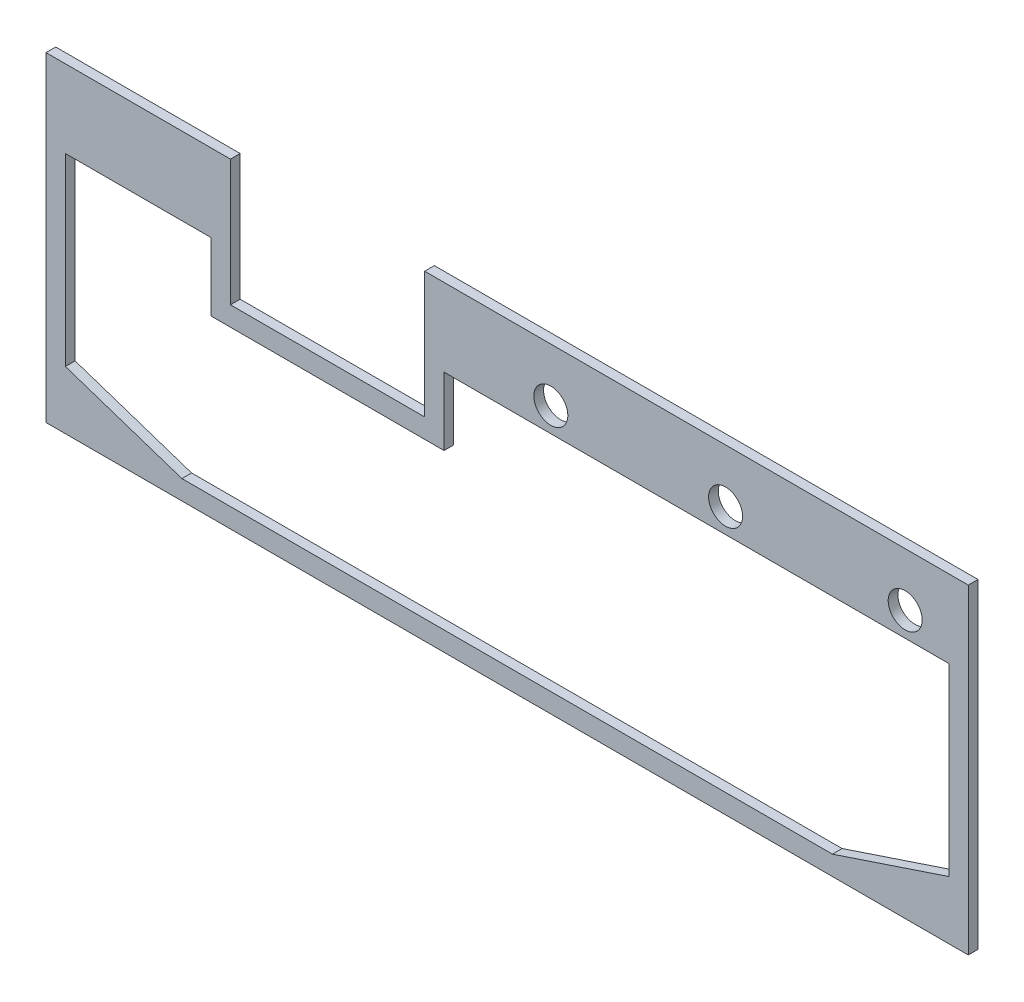
ISO-10303-21;
HEADER;
FILE_DESCRIPTION(('STEP AP214'),'2;1');
FILE_NAME('part.step','',(''),(''),'','','');
FILE_SCHEMA(('AUTOMOTIVE_DESIGN { 1 0 10303 214 1 1 1 1 }'));
ENDSEC;
DATA;
#1=APPLICATION_CONTEXT('core data for automotive mechanical design processes');
#2=APPLICATION_PROTOCOL_DEFINITION('international standard','automotive_design',2000,#1);
#3=PRODUCT_CONTEXT('',#1,'mechanical');
#4=PRODUCT('Part','Part','',(#3));
#5=PRODUCT_RELATED_PRODUCT_CATEGORY('part','',(#4));
#6=PRODUCT_DEFINITION_FORMATION('','',#4);
#7=PRODUCT_DEFINITION_CONTEXT('part definition',#1,'design');
#8=PRODUCT_DEFINITION('design','',#6,#7);
#9=PRODUCT_DEFINITION_SHAPE('','',#8);
#10=(LENGTH_UNIT() NAMED_UNIT(*) SI_UNIT(.MILLI.,.METRE.));
#11=(NAMED_UNIT(*) PLANE_ANGLE_UNIT() SI_UNIT($,.RADIAN.));
#12=(NAMED_UNIT(*) SI_UNIT($,.STERADIAN.) SOLID_ANGLE_UNIT());
#13=UNCERTAINTY_MEASURE_WITH_UNIT(LENGTH_MEASURE(1.E-05),#10,'distance_accuracy_value','');
#14=(GEOMETRIC_REPRESENTATION_CONTEXT(3) GLOBAL_UNCERTAINTY_ASSIGNED_CONTEXT((#13)) GLOBAL_UNIT_ASSIGNED_CONTEXT((#10,
#11,#12)) REPRESENTATION_CONTEXT('',''));
#15=CARTESIAN_POINT('',(0.,0.,0.));
#16=DIRECTION('',(0.,0.,1.));
#17=DIRECTION('',(1.,0.,0.));
#18=AXIS2_PLACEMENT_3D('',#15,#16,#17);
#19=CARTESIAN_POINT('',(0.,0.,1.));
#20=DIRECTION('',(0.,0.,-1.));
#21=DIRECTION('',(-1.,0.,0.));
#22=AXIS2_PLACEMENT_3D('',#19,#20,#21);
#23=PLANE('',#22);
#24=CARTESIAN_POINT('',(-41.,2.5,1.));
#25=DIRECTION('',(0.,0.,1.));
#26=DIRECTION('',(1.,0.,0.));
#27=AXIS2_PLACEMENT_3D('',#24,#25,#26);
#28=CIRCLE('',#27,1.75);
#29=CARTESIAN_POINT('',(-39.25,2.5,1.));
#30=VERTEX_POINT('',#29);
#31=EDGE_CURVE('E469',#30,#30,#28,.T.);
#32=ORIENTED_EDGE('',*,*,#31,.F.);
#33=EDGE_LOOP('',(#32));
#34=FACE_BOUND('',#33,.T.);
#35=CARTESIAN_POINT('',(-23.,2.5,1.));
#36=DIRECTION('',(0.,0.,1.));
#37=DIRECTION('',(1.,0.,0.));
#38=AXIS2_PLACEMENT_3D('',#35,#36,#37);
#39=CIRCLE('',#38,1.75);
#40=CARTESIAN_POINT('',(-21.25,2.5,1.));
#41=VERTEX_POINT('',#40);
#42=EDGE_CURVE('E474',#41,#41,#39,.T.);
#43=ORIENTED_EDGE('',*,*,#42,.F.);
#44=EDGE_LOOP('',(#43));
#45=FACE_BOUND('',#44,.T.);
#46=DIRECTION('',(-1.,0.,0.));
#47=VECTOR('',#46,1.);
#48=CARTESIAN_POINT('',(-54.,7.99999999999999,1.));
#49=LINE('',#48,#47);
#50=CARTESIAN_POINT('',(2.,7.99999999999999,1.));
#51=VERTEX_POINT('',#50);
#52=CARTESIAN_POINT('',(-54.,7.99999999999999,1.));
#53=VERTEX_POINT('',#52);
#54=EDGE_CURVE('E277',#51,#53,#49,.T.);
#55=ORIENTED_EDGE('',*,*,#54,.T.);
#56=DIRECTION('',(0.,-1.,0.));
#57=VECTOR('',#56,1.);
#58=CARTESIAN_POINT('',(-54.,-5.,1.));
#59=LINE('',#58,#57);
#60=CARTESIAN_POINT('',(-54.,-5.,1.));
#61=VERTEX_POINT('',#60);
#62=EDGE_CURVE('E281',#53,#61,#59,.T.);
#63=ORIENTED_EDGE('',*,*,#62,.T.);
#64=DIRECTION('',(-1.,0.,0.));
#65=VECTOR('',#64,1.);
#66=CARTESIAN_POINT('',(-74.,-5.,1.));
#67=LINE('',#66,#65);
#68=CARTESIAN_POINT('',(-74.,-5.,1.));
#69=VERTEX_POINT('',#68);
#70=EDGE_CURVE('E285',#61,#69,#67,.T.);
#71=ORIENTED_EDGE('',*,*,#70,.T.);
#72=DIRECTION('',(0.,1.,0.));
#73=VECTOR('',#72,1.);
#74=CARTESIAN_POINT('',(-74.,7.99999999999999,1.));
#75=LINE('',#74,#73);
#76=CARTESIAN_POINT('',(-74.,7.99999999999999,1.));
#77=VERTEX_POINT('',#76);
#78=EDGE_CURVE('E288',#69,#77,#75,.T.);
#79=ORIENTED_EDGE('',*,*,#78,.T.);
#80=DIRECTION('',(-1.,0.,0.));
#81=VECTOR('',#80,1.);
#82=CARTESIAN_POINT('',(-93.,7.99999999999999,1.));
#83=LINE('',#82,#81);
#84=CARTESIAN_POINT('',(-93.,7.99999999999999,1.));
#85=VERTEX_POINT('',#84);
#86=EDGE_CURVE('E291',#77,#85,#83,.T.);
#87=ORIENTED_EDGE('',*,*,#86,.T.);
#88=DIRECTION('',(0.,-1.,0.));
#89=VECTOR('',#88,1.);
#90=CARTESIAN_POINT('',(-93.,7.99999999999999,1.));
#91=LINE('',#90,#89);
#92=CARTESIAN_POINT('',(-93.,-25.,1.));
#93=VERTEX_POINT('',#92);
#94=EDGE_CURVE('E294',#85,#93,#91,.T.);
#95=ORIENTED_EDGE('',*,*,#94,.T.);
#96=DIRECTION('',(1.,0.,0.));
#97=VECTOR('',#96,1.);
#98=CARTESIAN_POINT('',(2.,-25.,1.));
#99=LINE('',#98,#97);
#100=CARTESIAN_POINT('',(2.,-25.,1.));
#101=VERTEX_POINT('',#100);
#102=EDGE_CURVE('E297',#93,#101,#99,.T.);
#103=ORIENTED_EDGE('',*,*,#102,.T.);
#104=DIRECTION('',(0.,1.,0.));
#105=VECTOR('',#104,1.);
#106=CARTESIAN_POINT('',(2.,7.99999999999999,1.));
#107=LINE('',#106,#105);
#108=EDGE_CURVE('E300',#101,#51,#107,.T.);
#109=ORIENTED_EDGE('',*,*,#108,.T.);
#110=EDGE_LOOP('',(#55,#63,#71,#79,#87,#95,#103,#109));
#111=FACE_BOUND('',#110,.T.);
#112=DIRECTION('',(-1.,0.,0.));
#113=VECTOR('',#112,1.);
#114=CARTESIAN_POINT('',(-52.,0.,1.));
#115=LINE('',#114,#113);
#116=CARTESIAN_POINT('',(0.,0.,1.));
#117=VERTEX_POINT('',#116);
#118=CARTESIAN_POINT('',(-52.,0.,1.));
#119=VERTEX_POINT('',#118);
#120=EDGE_CURVE('E165',#117,#119,#115,.T.);
#121=ORIENTED_EDGE('',*,*,#120,.F.);
#122=DIRECTION('',(0.,1.,0.));
#123=VECTOR('',#122,1.);
#124=CARTESIAN_POINT('',(0.,0.,1.));
#125=LINE('',#124,#123);
#126=CARTESIAN_POINT('',(0.,-19.,1.));
#127=VERTEX_POINT('',#126);
#128=EDGE_CURVE('E214',#127,#117,#125,.T.);
#129=ORIENTED_EDGE('',*,*,#128,.F.);
#130=DIRECTION('',(0.948683298050514,0.316227766016838,0.));
#131=VECTOR('',#130,1.);
#132=CARTESIAN_POINT('',(0.,-19.,1.));
#133=LINE('',#132,#131);
#134=CARTESIAN_POINT('',(-12.,-23.,1.));
#135=VERTEX_POINT('',#134);
#136=EDGE_CURVE('E211',#135,#127,#133,.T.);
#137=ORIENTED_EDGE('',*,*,#136,.F.);
#138=DIRECTION('',(1.,0.,0.));
#139=VECTOR('',#138,1.);
#140=CARTESIAN_POINT('',(-12.,-23.,1.));
#141=LINE('',#140,#139);
#142=CARTESIAN_POINT('',(-79.,-23.,1.));
#143=VERTEX_POINT('',#142);
#144=EDGE_CURVE('E208',#143,#135,#141,.T.);
#145=ORIENTED_EDGE('',*,*,#144,.F.);
#146=DIRECTION('',(0.948683298050513,-0.316227766016838,0.));
#147=VECTOR('',#146,1.);
#148=CARTESIAN_POINT('',(-79.,-23.,1.));
#149=LINE('',#148,#147);
#150=CARTESIAN_POINT('',(-91.,-19.,1.));
#151=VERTEX_POINT('',#150);
#152=EDGE_CURVE('E205',#151,#143,#149,.T.);
#153=ORIENTED_EDGE('',*,*,#152,.F.);
#154=DIRECTION('',(0.,-1.,0.));
#155=VECTOR('',#154,1.);
#156=CARTESIAN_POINT('',(-91.,-19.,1.));
#157=LINE('',#156,#155);
#158=CARTESIAN_POINT('',(-91.,0.,1.));
#159=VERTEX_POINT('',#158);
#160=EDGE_CURVE('E202',#159,#151,#157,.T.);
#161=ORIENTED_EDGE('',*,*,#160,.F.);
#162=DIRECTION('',(-1.,0.,0.));
#163=VECTOR('',#162,1.);
#164=CARTESIAN_POINT('',(-91.,0.,1.));
#165=LINE('',#164,#163);
#166=CARTESIAN_POINT('',(-76.,0.,1.));
#167=VERTEX_POINT('',#166);
#168=EDGE_CURVE('E199',#167,#159,#165,.T.);
#169=ORIENTED_EDGE('',*,*,#168,.F.);
#170=DIRECTION('',(0.,1.,0.));
#171=VECTOR('',#170,1.);
#172=CARTESIAN_POINT('',(-76.,0.,1.));
#173=LINE('',#172,#171);
#174=CARTESIAN_POINT('',(-76.,-7.,1.));
#175=VERTEX_POINT('',#174);
#176=EDGE_CURVE('E193',#175,#167,#173,.T.);
#177=ORIENTED_EDGE('',*,*,#176,.F.);
#178=DIRECTION('',(-1.,0.,0.));
#179=VECTOR('',#178,1.);
#180=CARTESIAN_POINT('',(-76.,-7.,1.));
#181=LINE('',#180,#179);
#182=CARTESIAN_POINT('',(-52.,-7.,1.));
#183=VERTEX_POINT('',#182);
#184=EDGE_CURVE('E189',#183,#175,#181,.T.);
#185=ORIENTED_EDGE('',*,*,#184,.F.);
#186=DIRECTION('',(0.,-1.,0.));
#187=VECTOR('',#186,1.);
#188=CARTESIAN_POINT('',(-52.,-7.,1.));
#189=LINE('',#188,#187);
#190=EDGE_CURVE('E174',#119,#183,#189,.T.);
#191=ORIENTED_EDGE('',*,*,#190,.F.);
#192=EDGE_LOOP('',(#121,#129,#137,#145,#153,#161,#169,#177,#185,#191));
#193=FACE_BOUND('',#192,.T.);
#194=CARTESIAN_POINT('',(-4.5,2.5,1.));
#195=DIRECTION('',(0.,0.,1.));
#196=DIRECTION('',(1.,0.,0.));
#197=AXIS2_PLACEMENT_3D('',#194,#195,#196);
#198=CIRCLE('',#197,1.75);
#199=CARTESIAN_POINT('',(-2.75,2.5,1.));
#200=VERTEX_POINT('',#199);
#201=EDGE_CURVE('E486',#200,#200,#198,.T.);
#202=ORIENTED_EDGE('',*,*,#201,.F.);
#203=EDGE_LOOP('',(#202));
#204=FACE_BOUND('',#203,.T.);
#205=ADVANCED_FACE('F39',(#34,#45,#111,#193,#204),#23,.F.);
#206=CARTESIAN_POINT('',(0.,0.,0.));
#207=DIRECTION('',(0.,0.,-1.));
#208=DIRECTION('',(-1.,0.,0.));
#209=AXIS2_PLACEMENT_3D('',#206,#207,#208);
#210=PLANE('',#209);
#211=CARTESIAN_POINT('',(-41.,2.5,0.));
#212=DIRECTION('',(0.,0.,-1.));
#213=DIRECTION('',(-1.,0.,0.));
#214=AXIS2_PLACEMENT_3D('',#211,#212,#213);
#215=CIRCLE('',#214,1.75);
#216=CARTESIAN_POINT('',(-42.75,2.5,0.));
#217=VERTEX_POINT('',#216);
#218=EDGE_CURVE('E472',#217,#217,#215,.T.);
#219=ORIENTED_EDGE('',*,*,#218,.F.);
#220=EDGE_LOOP('',(#219));
#221=FACE_BOUND('',#220,.T.);
#222=CARTESIAN_POINT('',(-23.,2.5,0.));
#223=DIRECTION('',(0.,0.,-1.));
#224=DIRECTION('',(-1.,0.,0.));
#225=AXIS2_PLACEMENT_3D('',#222,#223,#224);
#226=CIRCLE('',#225,1.75);
#227=CARTESIAN_POINT('',(-24.75,2.5,0.));
#228=VERTEX_POINT('',#227);
#229=EDGE_CURVE('E479',#228,#228,#226,.T.);
#230=ORIENTED_EDGE('',*,*,#229,.F.);
#231=EDGE_LOOP('',(#230));
#232=FACE_BOUND('',#231,.T.);
#233=CARTESIAN_POINT('',(-4.5,2.5,0.));
#234=DIRECTION('',(0.,0.,-1.));
#235=DIRECTION('',(-1.,0.,0.));
#236=AXIS2_PLACEMENT_3D('',#233,#234,#235);
#237=CIRCLE('',#236,1.75);
#238=CARTESIAN_POINT('',(-6.25,2.5,0.));
#239=VERTEX_POINT('',#238);
#240=EDGE_CURVE('E219',#239,#239,#237,.T.);
#241=ORIENTED_EDGE('',*,*,#240,.F.);
#242=EDGE_LOOP('',(#241));
#243=FACE_BOUND('',#242,.T.);
#244=DIRECTION('',(-1.,0.,0.));
#245=VECTOR('',#244,1.);
#246=CARTESIAN_POINT('',(-54.,7.99999999999999,0.));
#247=LINE('',#246,#245);
#248=CARTESIAN_POINT('',(2.,7.99999999999999,0.));
#249=VERTEX_POINT('',#248);
#250=CARTESIAN_POINT('',(-54.,7.99999999999999,0.));
#251=VERTEX_POINT('',#250);
#252=EDGE_CURVE('E183',#249,#251,#247,.T.);
#253=ORIENTED_EDGE('',*,*,#252,.F.);
#254=DIRECTION('',(0.,1.,0.));
#255=VECTOR('',#254,1.);
#256=CARTESIAN_POINT('',(2.,7.99999999999999,0.));
#257=LINE('',#256,#255);
#258=CARTESIAN_POINT('',(2.,-25.,0.));
#259=VERTEX_POINT('',#258);
#260=EDGE_CURVE('E282',#259,#249,#257,.T.);
#261=ORIENTED_EDGE('',*,*,#260,.F.);
#262=DIRECTION('',(1.,0.,0.));
#263=VECTOR('',#262,1.);
#264=CARTESIAN_POINT('',(2.,-25.,0.));
#265=LINE('',#264,#263);
#266=CARTESIAN_POINT('',(-93.,-25.,0.));
#267=VERTEX_POINT('',#266);
#268=EDGE_CURVE('E322',#267,#259,#265,.T.);
#269=ORIENTED_EDGE('',*,*,#268,.F.);
#270=DIRECTION('',(0.,-1.,0.));
#271=VECTOR('',#270,1.);
#272=CARTESIAN_POINT('',(-93.,7.99999999999999,0.));
#273=LINE('',#272,#271);
#274=CARTESIAN_POINT('',(-93.,7.99999999999999,0.));
#275=VERTEX_POINT('',#274);
#276=EDGE_CURVE('E319',#275,#267,#273,.T.);
#277=ORIENTED_EDGE('',*,*,#276,.F.);
#278=DIRECTION('',(-1.,0.,0.));
#279=VECTOR('',#278,1.);
#280=CARTESIAN_POINT('',(-93.,7.99999999999999,0.));
#281=LINE('',#280,#279);
#282=CARTESIAN_POINT('',(-74.,7.99999999999999,0.));
#283=VERTEX_POINT('',#282);
#284=EDGE_CURVE('E316',#283,#275,#281,.T.);
#285=ORIENTED_EDGE('',*,*,#284,.F.);
#286=DIRECTION('',(0.,1.,0.));
#287=VECTOR('',#286,1.);
#288=CARTESIAN_POINT('',(-74.,7.99999999999999,0.));
#289=LINE('',#288,#287);
#290=CARTESIAN_POINT('',(-74.,-5.,0.));
#291=VERTEX_POINT('',#290);
#292=EDGE_CURVE('E313',#291,#283,#289,.T.);
#293=ORIENTED_EDGE('',*,*,#292,.F.);
#294=DIRECTION('',(-1.,0.,0.));
#295=VECTOR('',#294,1.);
#296=CARTESIAN_POINT('',(-74.,-5.,0.));
#297=LINE('',#296,#295);
#298=CARTESIAN_POINT('',(-54.,-5.,0.));
#299=VERTEX_POINT('',#298);
#300=EDGE_CURVE('E310',#299,#291,#297,.T.);
#301=ORIENTED_EDGE('',*,*,#300,.F.);
#302=DIRECTION('',(0.,-1.,0.));
#303=VECTOR('',#302,1.);
#304=CARTESIAN_POINT('',(-54.,-5.,0.));
#305=LINE('',#304,#303);
#306=EDGE_CURVE('E307',#251,#299,#305,.T.);
#307=ORIENTED_EDGE('',*,*,#306,.F.);
#308=EDGE_LOOP('',(#253,#261,#269,#277,#285,#293,#301,#307));
#309=FACE_BOUND('',#308,.T.);
#310=DIRECTION('',(0.,1.,0.));
#311=VECTOR('',#310,1.);
#312=CARTESIAN_POINT('',(0.,0.,0.));
#313=LINE('',#312,#311);
#314=CARTESIAN_POINT('',(0.,-19.,0.));
#315=VERTEX_POINT('',#314);
#316=CARTESIAN_POINT('',(0.,0.,0.));
#317=VERTEX_POINT('',#316);
#318=EDGE_CURVE('E175',#315,#317,#313,.T.);
#319=ORIENTED_EDGE('',*,*,#318,.T.);
#320=DIRECTION('',(-1.,0.,0.));
#321=VECTOR('',#320,1.);
#322=CARTESIAN_POINT('',(-52.,0.,0.));
#323=LINE('',#322,#321);
#324=CARTESIAN_POINT('',(-52.,0.,0.));
#325=VERTEX_POINT('',#324);
#326=EDGE_CURVE('E63',#317,#325,#323,.T.);
#327=ORIENTED_EDGE('',*,*,#326,.T.);
#328=DIRECTION('',(0.,-1.,0.));
#329=VECTOR('',#328,1.);
#330=CARTESIAN_POINT('',(-52.,-7.,0.));
#331=LINE('',#330,#329);
#332=CARTESIAN_POINT('',(-52.,-7.,0.));
#333=VERTEX_POINT('',#332);
#334=EDGE_CURVE('E181',#325,#333,#331,.T.);
#335=ORIENTED_EDGE('',*,*,#334,.T.);
#336=DIRECTION('',(-1.,0.,0.));
#337=VECTOR('',#336,1.);
#338=CARTESIAN_POINT('',(-76.,-7.,0.));
#339=LINE('',#338,#337);
#340=CARTESIAN_POINT('',(-76.,-7.,0.));
#341=VERTEX_POINT('',#340);
#342=EDGE_CURVE('E222',#333,#341,#339,.T.);
#343=ORIENTED_EDGE('',*,*,#342,.T.);
#344=DIRECTION('',(0.,1.,0.));
#345=VECTOR('',#344,1.);
#346=CARTESIAN_POINT('',(-76.,0.,0.));
#347=LINE('',#346,#345);
#348=CARTESIAN_POINT('',(-76.,0.,0.));
#349=VERTEX_POINT('',#348);
#350=EDGE_CURVE('E226',#341,#349,#347,.T.);
#351=ORIENTED_EDGE('',*,*,#350,.T.);
#352=DIRECTION('',(-1.,0.,0.));
#353=VECTOR('',#352,1.);
#354=CARTESIAN_POINT('',(-91.,0.,0.));
#355=LINE('',#354,#353);
#356=CARTESIAN_POINT('',(-91.,0.,0.));
#357=VERTEX_POINT('',#356);
#358=EDGE_CURVE('E230',#349,#357,#355,.T.);
#359=ORIENTED_EDGE('',*,*,#358,.T.);
#360=DIRECTION('',(0.,-1.,0.));
#361=VECTOR('',#360,1.);
#362=CARTESIAN_POINT('',(-91.,-19.,0.));
#363=LINE('',#362,#361);
#364=CARTESIAN_POINT('',(-91.,-19.,0.));
#365=VERTEX_POINT('',#364);
#366=EDGE_CURVE('E234',#357,#365,#363,.T.);
#367=ORIENTED_EDGE('',*,*,#366,.T.);
#368=DIRECTION('',(0.948683298050513,-0.316227766016838,0.));
#369=VECTOR('',#368,1.);
#370=CARTESIAN_POINT('',(-79.,-23.,0.));
#371=LINE('',#370,#369);
#372=CARTESIAN_POINT('',(-79.,-23.,0.));
#373=VERTEX_POINT('',#372);
#374=EDGE_CURVE('E238',#365,#373,#371,.T.);
#375=ORIENTED_EDGE('',*,*,#374,.T.);
#376=DIRECTION('',(1.,0.,0.));
#377=VECTOR('',#376,1.);
#378=CARTESIAN_POINT('',(-12.,-23.,0.));
#379=LINE('',#378,#377);
#380=CARTESIAN_POINT('',(-12.,-23.,0.));
#381=VERTEX_POINT('',#380);
#382=EDGE_CURVE('E242',#373,#381,#379,.T.);
#383=ORIENTED_EDGE('',*,*,#382,.T.);
#384=DIRECTION('',(0.948683298050514,0.316227766016838,0.));
#385=VECTOR('',#384,1.);
#386=CARTESIAN_POINT('',(0.,-19.,0.));
#387=LINE('',#386,#385);
#388=EDGE_CURVE('E246',#381,#315,#387,.T.);
#389=ORIENTED_EDGE('',*,*,#388,.T.);
#390=EDGE_LOOP('',(#319,#327,#335,#343,#351,#359,#367,#375,#383,#389));
#391=FACE_BOUND('',#390,.T.);
#392=ADVANCED_FACE('F361',(#221,#232,#243,#309,#391),#210,.T.);
#393=CARTESIAN_POINT('',(-54.,7.99999999999999,1.));
#394=DIRECTION('',(0.,-1.,0.));
#395=DIRECTION('',(0.,0.,-1.));
#396=AXIS2_PLACEMENT_3D('',#393,#394,#395);
#397=PLANE('',#396);
#398=ORIENTED_EDGE('',*,*,#252,.T.);
#399=DIRECTION('',(0.,0.,-1.));
#400=VECTOR('',#399,1.);
#401=CARTESIAN_POINT('',(-54.,7.99999999999999,1.));
#402=LINE('',#401,#400);
#403=EDGE_CURVE('E11',#53,#251,#402,.T.);
#404=ORIENTED_EDGE('',*,*,#403,.F.);
#405=ORIENTED_EDGE('',*,*,#54,.F.);
#406=DIRECTION('',(0.,0.,-1.));
#407=VECTOR('',#406,1.);
#408=CARTESIAN_POINT('',(2.,7.99999999999999,1.));
#409=LINE('',#408,#407);
#410=EDGE_CURVE('E303',#51,#249,#409,.T.);
#411=ORIENTED_EDGE('',*,*,#410,.T.);
#412=EDGE_LOOP('',(#398,#404,#405,#411));
#413=FACE_BOUND('',#412,.T.);
#414=ADVANCED_FACE('F41',(#413),#397,.F.);
#415=CARTESIAN_POINT('',(-54.,-5.,1.));
#416=DIRECTION('',(1.,0.,0.));
#417=DIRECTION('',(0.,0.,-1.));
#418=AXIS2_PLACEMENT_3D('',#415,#416,#417);
#419=PLANE('',#418);
#420=ORIENTED_EDGE('',*,*,#306,.T.);
#421=DIRECTION('',(0.,0.,-1.));
#422=VECTOR('',#421,1.);
#423=CARTESIAN_POINT('',(-54.,-5.,1.));
#424=LINE('',#423,#422);
#425=EDGE_CURVE('E48',#61,#299,#424,.T.);
#426=ORIENTED_EDGE('',*,*,#425,.F.);
#427=ORIENTED_EDGE('',*,*,#62,.F.);
#428=ORIENTED_EDGE('',*,*,#403,.T.);
#429=EDGE_LOOP('',(#420,#426,#427,#428));
#430=FACE_BOUND('',#429,.T.);
#431=ADVANCED_FACE('F378',(#430),#419,.F.);
#432=CARTESIAN_POINT('',(-74.,-5.,1.));
#433=DIRECTION('',(0.,-1.,0.));
#434=DIRECTION('',(0.,0.,-1.));
#435=AXIS2_PLACEMENT_3D('',#432,#433,#434);
#436=PLANE('',#435);
#437=ORIENTED_EDGE('',*,*,#300,.T.);
#438=DIRECTION('',(0.,0.,-1.));
#439=VECTOR('',#438,1.);
#440=CARTESIAN_POINT('',(-74.,-5.,1.));
#441=LINE('',#440,#439);
#442=EDGE_CURVE('E346',#69,#291,#441,.T.);
#443=ORIENTED_EDGE('',*,*,#442,.F.);
#444=ORIENTED_EDGE('',*,*,#70,.F.);
#445=ORIENTED_EDGE('',*,*,#425,.T.);
#446=EDGE_LOOP('',(#437,#443,#444,#445));
#447=FACE_BOUND('',#446,.T.);
#448=ADVANCED_FACE('F355',(#447),#436,.F.);
#449=CARTESIAN_POINT('',(-74.,7.99999999999999,1.));
#450=DIRECTION('',(-1.,0.,0.));
#451=DIRECTION('',(0.,0.,1.));
#452=AXIS2_PLACEMENT_3D('',#449,#450,#451);
#453=PLANE('',#452);
#454=ORIENTED_EDGE('',*,*,#292,.T.);
#455=DIRECTION('',(0.,0.,-1.));
#456=VECTOR('',#455,1.);
#457=CARTESIAN_POINT('',(-74.,7.99999999999999,1.));
#458=LINE('',#457,#456);
#459=EDGE_CURVE('E342',#77,#283,#458,.T.);
#460=ORIENTED_EDGE('',*,*,#459,.F.);
#461=ORIENTED_EDGE('',*,*,#78,.F.);
#462=ORIENTED_EDGE('',*,*,#442,.T.);
#463=EDGE_LOOP('',(#454,#460,#461,#462));
#464=FACE_BOUND('',#463,.T.);
#465=ADVANCED_FACE('F367',(#464),#453,.F.);
#466=CARTESIAN_POINT('',(-93.,7.99999999999999,1.));
#467=DIRECTION('',(0.,-1.,0.));
#468=DIRECTION('',(0.,0.,-1.));
#469=AXIS2_PLACEMENT_3D('',#466,#467,#468);
#470=PLANE('',#469);
#471=ORIENTED_EDGE('',*,*,#284,.T.);
#472=DIRECTION('',(0.,0.,-1.));
#473=VECTOR('',#472,1.);
#474=CARTESIAN_POINT('',(-93.,7.99999999999999,1.));
#475=LINE('',#474,#473);
#476=EDGE_CURVE('E338',#85,#275,#475,.T.);
#477=ORIENTED_EDGE('',*,*,#476,.F.);
#478=ORIENTED_EDGE('',*,*,#86,.F.);
#479=ORIENTED_EDGE('',*,*,#459,.T.);
#480=EDGE_LOOP('',(#471,#477,#478,#479));
#481=FACE_BOUND('',#480,.T.);
#482=ADVANCED_FACE('F371',(#481),#470,.F.);
#483=CARTESIAN_POINT('',(-93.,7.99999999999999,1.));
#484=DIRECTION('',(1.,0.,0.));
#485=DIRECTION('',(0.,0.,-1.));
#486=AXIS2_PLACEMENT_3D('',#483,#484,#485);
#487=PLANE('',#486);
#488=ORIENTED_EDGE('',*,*,#276,.T.);
#489=DIRECTION('',(0.,0.,-1.));
#490=VECTOR('',#489,1.);
#491=CARTESIAN_POINT('',(-93.,-25.,1.));
#492=LINE('',#491,#490);
#493=EDGE_CURVE('E334',#93,#267,#492,.T.);
#494=ORIENTED_EDGE('',*,*,#493,.F.);
#495=ORIENTED_EDGE('',*,*,#94,.F.);
#496=ORIENTED_EDGE('',*,*,#476,.T.);
#497=EDGE_LOOP('',(#488,#494,#495,#496));
#498=FACE_BOUND('',#497,.T.);
#499=ADVANCED_FACE('F391',(#498),#487,.F.);
#500=CARTESIAN_POINT('',(2.,-25.,1.));
#501=DIRECTION('',(0.,1.,0.));
#502=DIRECTION('',(-1.,0.,0.));
#503=AXIS2_PLACEMENT_3D('',#500,#501,#502);
#504=PLANE('',#503);
#505=ORIENTED_EDGE('',*,*,#268,.T.);
#506=DIRECTION('',(0.,0.,-1.));
#507=VECTOR('',#506,1.);
#508=CARTESIAN_POINT('',(2.,-25.,1.));
#509=LINE('',#508,#507);
#510=EDGE_CURVE('E330',#101,#259,#509,.T.);
#511=ORIENTED_EDGE('',*,*,#510,.F.);
#512=ORIENTED_EDGE('',*,*,#102,.F.);
#513=ORIENTED_EDGE('',*,*,#493,.T.);
#514=EDGE_LOOP('',(#505,#511,#512,#513));
#515=FACE_BOUND('',#514,.T.);
#516=ADVANCED_FACE('F389',(#515),#504,.F.);
#517=CARTESIAN_POINT('',(2.,7.99999999999999,1.));
#518=DIRECTION('',(-1.,0.,0.));
#519=DIRECTION('',(0.,-1.,0.));
#520=AXIS2_PLACEMENT_3D('',#517,#518,#519);
#521=PLANE('',#520);
#522=ORIENTED_EDGE('',*,*,#260,.T.);
#523=ORIENTED_EDGE('',*,*,#410,.F.);
#524=ORIENTED_EDGE('',*,*,#108,.F.);
#525=ORIENTED_EDGE('',*,*,#510,.T.);
#526=EDGE_LOOP('',(#522,#523,#524,#525));
#527=FACE_BOUND('',#526,.T.);
#528=ADVANCED_FACE('F384',(#527),#521,.F.);
#529=CARTESIAN_POINT('',(-52.,0.,1.));
#530=DIRECTION('',(0.,-1.,0.));
#531=DIRECTION('',(0.,0.,-1.));
#532=AXIS2_PLACEMENT_3D('',#529,#530,#531);
#533=PLANE('',#532);
#534=ORIENTED_EDGE('',*,*,#326,.F.);
#535=DIRECTION('',(0.,0.,-1.));
#536=VECTOR('',#535,1.);
#537=CARTESIAN_POINT('',(0.,0.,1.));
#538=LINE('',#537,#536);
#539=EDGE_CURVE('E169',#117,#317,#538,.T.);
#540=ORIENTED_EDGE('',*,*,#539,.F.);
#541=ORIENTED_EDGE('',*,*,#120,.T.);
#542=DIRECTION('',(0.,0.,-1.));
#543=VECTOR('',#542,1.);
#544=CARTESIAN_POINT('',(-52.,0.,1.));
#545=LINE('',#544,#543);
#546=EDGE_CURVE('E168',#119,#325,#545,.T.);
#547=ORIENTED_EDGE('',*,*,#546,.T.);
#548=EDGE_LOOP('',(#534,#540,#541,#547));
#549=FACE_BOUND('',#548,.T.);
#550=ADVANCED_FACE('F167',(#549),#533,.T.);
#551=CARTESIAN_POINT('',(-52.,-7.,1.));
#552=DIRECTION('',(1.,0.,0.));
#553=DIRECTION('',(0.,0.,-1.));
#554=AXIS2_PLACEMENT_3D('',#551,#552,#553);
#555=PLANE('',#554);
#556=ORIENTED_EDGE('',*,*,#334,.F.);
#557=ORIENTED_EDGE('',*,*,#546,.F.);
#558=ORIENTED_EDGE('',*,*,#190,.T.);
#559=DIRECTION('',(0.,0.,-1.));
#560=VECTOR('',#559,1.);
#561=CARTESIAN_POINT('',(-52.,-7.,1.));
#562=LINE('',#561,#560);
#563=EDGE_CURVE('E184',#183,#333,#562,.T.);
#564=ORIENTED_EDGE('',*,*,#563,.T.);
#565=EDGE_LOOP('',(#556,#557,#558,#564));
#566=FACE_BOUND('',#565,.T.);
#567=ADVANCED_FACE('F178',(#566),#555,.T.);
#568=CARTESIAN_POINT('',(-76.,-7.,1.));
#569=DIRECTION('',(0.,-1.,0.));
#570=DIRECTION('',(0.,0.,-1.));
#571=AXIS2_PLACEMENT_3D('',#568,#569,#570);
#572=PLANE('',#571);
#573=ORIENTED_EDGE('',*,*,#342,.F.);
#574=ORIENTED_EDGE('',*,*,#563,.F.);
#575=ORIENTED_EDGE('',*,*,#184,.T.);
#576=DIRECTION('',(0.,0.,-1.));
#577=VECTOR('',#576,1.);
#578=CARTESIAN_POINT('',(-76.,-7.,1.));
#579=LINE('',#578,#577);
#580=EDGE_CURVE('E272',#175,#341,#579,.T.);
#581=ORIENTED_EDGE('',*,*,#580,.T.);
#582=EDGE_LOOP('',(#573,#574,#575,#581));
#583=FACE_BOUND('',#582,.T.);
#584=ADVANCED_FACE('F420',(#583),#572,.T.);
#585=CARTESIAN_POINT('',(-76.,0.,1.));
#586=DIRECTION('',(-1.,0.,0.));
#587=DIRECTION('',(0.,0.,1.));
#588=AXIS2_PLACEMENT_3D('',#585,#586,#587);
#589=PLANE('',#588);
#590=ORIENTED_EDGE('',*,*,#350,.F.);
#591=ORIENTED_EDGE('',*,*,#580,.F.);
#592=ORIENTED_EDGE('',*,*,#176,.T.);
#593=DIRECTION('',(0.,0.,-1.));
#594=VECTOR('',#593,1.);
#595=CARTESIAN_POINT('',(-76.,0.,1.));
#596=LINE('',#595,#594);
#597=EDGE_CURVE('E269',#167,#349,#596,.T.);
#598=ORIENTED_EDGE('',*,*,#597,.T.);
#599=EDGE_LOOP('',(#590,#591,#592,#598));
#600=FACE_BOUND('',#599,.T.);
#601=ADVANCED_FACE('F424',(#600),#589,.T.);
#602=CARTESIAN_POINT('',(-91.,0.,1.));
#603=DIRECTION('',(0.,-1.,0.));
#604=DIRECTION('',(0.,0.,-1.));
#605=AXIS2_PLACEMENT_3D('',#602,#603,#604);
#606=PLANE('',#605);
#607=ORIENTED_EDGE('',*,*,#358,.F.);
#608=ORIENTED_EDGE('',*,*,#597,.F.);
#609=ORIENTED_EDGE('',*,*,#168,.T.);
#610=DIRECTION('',(0.,0.,-1.));
#611=VECTOR('',#610,1.);
#612=CARTESIAN_POINT('',(-91.,0.,1.));
#613=LINE('',#612,#611);
#614=EDGE_CURVE('E266',#159,#357,#613,.T.);
#615=ORIENTED_EDGE('',*,*,#614,.T.);
#616=EDGE_LOOP('',(#607,#608,#609,#615));
#617=FACE_BOUND('',#616,.T.);
#618=ADVANCED_FACE('F430',(#617),#606,.T.);
#619=CARTESIAN_POINT('',(-91.,-19.,1.));
#620=DIRECTION('',(1.,0.,0.));
#621=DIRECTION('',(0.,0.,-1.));
#622=AXIS2_PLACEMENT_3D('',#619,#620,#621);
#623=PLANE('',#622);
#624=ORIENTED_EDGE('',*,*,#366,.F.);
#625=ORIENTED_EDGE('',*,*,#614,.F.);
#626=ORIENTED_EDGE('',*,*,#160,.T.);
#627=DIRECTION('',(0.,0.,-1.));
#628=VECTOR('',#627,1.);
#629=CARTESIAN_POINT('',(-91.,-19.,1.));
#630=LINE('',#629,#628);
#631=EDGE_CURVE('E263',#151,#365,#630,.T.);
#632=ORIENTED_EDGE('',*,*,#631,.T.);
#633=EDGE_LOOP('',(#624,#625,#626,#632));
#634=FACE_BOUND('',#633,.T.);
#635=ADVANCED_FACE('F434',(#634),#623,.T.);
#636=CARTESIAN_POINT('',(-79.,-23.,1.));
#637=DIRECTION('',(0.316227766016838,0.948683298050514,0.));
#638=DIRECTION('',(-0.948683298050514,0.316227766016838,0.));
#639=AXIS2_PLACEMENT_3D('',#636,#637,#638);
#640=PLANE('',#639);
#641=ORIENTED_EDGE('',*,*,#374,.F.);
#642=ORIENTED_EDGE('',*,*,#631,.F.);
#643=ORIENTED_EDGE('',*,*,#152,.T.);
#644=DIRECTION('',(0.,0.,-1.));
#645=VECTOR('',#644,1.);
#646=CARTESIAN_POINT('',(-79.,-23.,1.));
#647=LINE('',#646,#645);
#648=EDGE_CURVE('E260',#143,#373,#647,.T.);
#649=ORIENTED_EDGE('',*,*,#648,.T.);
#650=EDGE_LOOP('',(#641,#642,#643,#649));
#651=FACE_BOUND('',#650,.T.);
#652=ADVANCED_FACE('F438',(#651),#640,.T.);
#653=CARTESIAN_POINT('',(-12.,-23.,1.));
#654=DIRECTION('',(0.,1.,0.));
#655=DIRECTION('',(-1.,0.,0.));
#656=AXIS2_PLACEMENT_3D('',#653,#654,#655);
#657=PLANE('',#656);
#658=ORIENTED_EDGE('',*,*,#382,.F.);
#659=ORIENTED_EDGE('',*,*,#648,.F.);
#660=ORIENTED_EDGE('',*,*,#144,.T.);
#661=DIRECTION('',(0.,0.,-1.));
#662=VECTOR('',#661,1.);
#663=CARTESIAN_POINT('',(-12.,-23.,1.));
#664=LINE('',#663,#662);
#665=EDGE_CURVE('E257',#135,#381,#664,.T.);
#666=ORIENTED_EDGE('',*,*,#665,.T.);
#667=EDGE_LOOP('',(#658,#659,#660,#666));
#668=FACE_BOUND('',#667,.T.);
#669=ADVANCED_FACE('F442',(#668),#657,.T.);
#670=CARTESIAN_POINT('',(0.,-19.,1.));
#671=DIRECTION('',(-0.316227766016838,0.948683298050514,0.));
#672=DIRECTION('',(-0.948683298050514,-0.316227766016838,0.));
#673=AXIS2_PLACEMENT_3D('',#670,#671,#672);
#674=PLANE('',#673);
#675=ORIENTED_EDGE('',*,*,#388,.F.);
#676=ORIENTED_EDGE('',*,*,#665,.F.);
#677=ORIENTED_EDGE('',*,*,#136,.T.);
#678=DIRECTION('',(0.,0.,-1.));
#679=VECTOR('',#678,1.);
#680=CARTESIAN_POINT('',(0.,-19.,1.));
#681=LINE('',#680,#679);
#682=EDGE_CURVE('E55',#127,#315,#681,.T.);
#683=ORIENTED_EDGE('',*,*,#682,.T.);
#684=EDGE_LOOP('',(#675,#676,#677,#683));
#685=FACE_BOUND('',#684,.T.);
#686=ADVANCED_FACE('F446',(#685),#674,.T.);
#687=CARTESIAN_POINT('',(0.,0.,1.));
#688=DIRECTION('',(-1.,0.,0.));
#689=DIRECTION('',(0.,-1.,0.));
#690=AXIS2_PLACEMENT_3D('',#687,#688,#689);
#691=PLANE('',#690);
#692=ORIENTED_EDGE('',*,*,#318,.F.);
#693=ORIENTED_EDGE('',*,*,#682,.F.);
#694=ORIENTED_EDGE('',*,*,#128,.T.);
#695=ORIENTED_EDGE('',*,*,#539,.T.);
#696=EDGE_LOOP('',(#692,#693,#694,#695));
#697=FACE_BOUND('',#696,.T.);
#698=ADVANCED_FACE('F450',(#697),#691,.T.);
#699=CARTESIAN_POINT('',(-4.5,2.5,1.));
#700=DIRECTION('',(0.,0.,1.));
#701=DIRECTION('',(1.,0.,0.));
#702=AXIS2_PLACEMENT_3D('',#699,#700,#701);
#703=CYLINDRICAL_SURFACE('',#702,1.75);
#704=ORIENTED_EDGE('',*,*,#201,.T.);
#705=EDGE_LOOP('',(#704));
#706=FACE_BOUND('',#705,.T.);
#707=ORIENTED_EDGE('',*,*,#240,.T.);
#708=EDGE_LOOP('',(#707));
#709=FACE_BOUND('',#708,.T.);
#710=ADVANCED_FACE('F454',(#706,#709),#703,.F.);
#711=CARTESIAN_POINT('',(-23.,2.5,1.));
#712=DIRECTION('',(0.,0.,1.));
#713=DIRECTION('',(1.,0.,0.));
#714=AXIS2_PLACEMENT_3D('',#711,#712,#713);
#715=CYLINDRICAL_SURFACE('',#714,1.75);
#716=ORIENTED_EDGE('',*,*,#42,.T.);
#717=EDGE_LOOP('',(#716));
#718=FACE_BOUND('',#717,.T.);
#719=ORIENTED_EDGE('',*,*,#229,.T.);
#720=EDGE_LOOP('',(#719));
#721=FACE_BOUND('',#720,.T.);
#722=ADVANCED_FACE('F457',(#718,#721),#715,.F.);
#723=CARTESIAN_POINT('',(-41.,2.5,1.));
#724=DIRECTION('',(0.,0.,1.));
#725=DIRECTION('',(1.,0.,0.));
#726=AXIS2_PLACEMENT_3D('',#723,#724,#725);
#727=CYLINDRICAL_SURFACE('',#726,1.75);
#728=ORIENTED_EDGE('',*,*,#31,.T.);
#729=EDGE_LOOP('',(#728));
#730=FACE_BOUND('',#729,.T.);
#731=ORIENTED_EDGE('',*,*,#218,.T.);
#732=EDGE_LOOP('',(#731));
#733=FACE_BOUND('',#732,.T.);
#734=ADVANCED_FACE('F461',(#730,#733),#727,.F.);
#735=CLOSED_SHELL('',(#205,#392,#414,#431,#448,#465,#482,#499,#516,#528,#550,#567,#584,#601,
#618,#635,#652,#669,#686,#698,#710,#722,#734));
#736=MANIFOLD_SOLID_BREP('B2',#735);
#737=ADVANCED_BREP_SHAPE_REPRESENTATION('',(#18,#736),#14);
#738=SHAPE_DEFINITION_REPRESENTATION(#9,#737);
ENDSEC;
END-ISO-10303-21;
